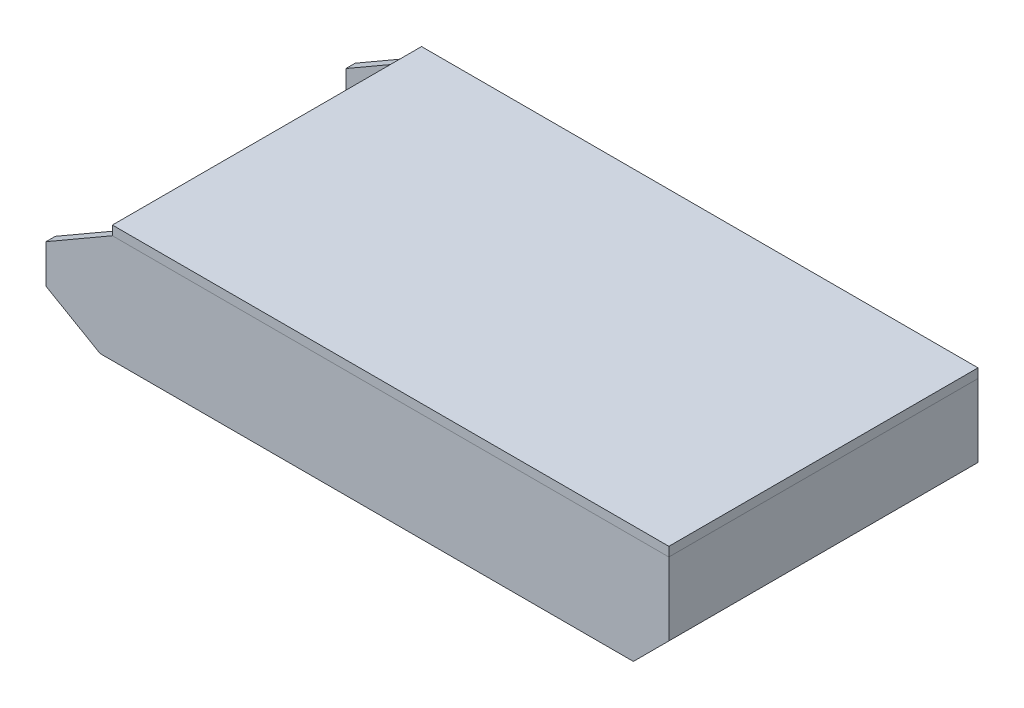
ISO-10303-21;
HEADER;
FILE_DESCRIPTION(('STEP AP214'),'2;1');
FILE_NAME('part.step','',(''),(''),'','','');
FILE_SCHEMA(('AUTOMOTIVE_DESIGN { 1 0 10303 214 1 1 1 1 }'));
ENDSEC;
DATA;
#1=APPLICATION_CONTEXT('core data for automotive mechanical design processes');
#2=APPLICATION_PROTOCOL_DEFINITION('international standard','automotive_design',2000,#1);
#3=PRODUCT_CONTEXT('',#1,'mechanical');
#4=PRODUCT('Part','Part','',(#3));
#5=PRODUCT_RELATED_PRODUCT_CATEGORY('part','',(#4));
#6=PRODUCT_DEFINITION_FORMATION('','',#4);
#7=PRODUCT_DEFINITION_CONTEXT('part definition',#1,'design');
#8=PRODUCT_DEFINITION('design','',#6,#7);
#9=PRODUCT_DEFINITION_SHAPE('','',#8);
#10=(LENGTH_UNIT() NAMED_UNIT(*) SI_UNIT(.MILLI.,.METRE.));
#11=(NAMED_UNIT(*) PLANE_ANGLE_UNIT() SI_UNIT($,.RADIAN.));
#12=(NAMED_UNIT(*) SI_UNIT($,.STERADIAN.) SOLID_ANGLE_UNIT());
#13=UNCERTAINTY_MEASURE_WITH_UNIT(LENGTH_MEASURE(1.E-05),#10,'distance_accuracy_value','');
#14=(GEOMETRIC_REPRESENTATION_CONTEXT(3) GLOBAL_UNCERTAINTY_ASSIGNED_CONTEXT((#13)) GLOBAL_UNIT_ASSIGNED_CONTEXT((#10,
#11,#12)) REPRESENTATION_CONTEXT('',''));
#15=CARTESIAN_POINT('',(0.,0.,0.));
#16=DIRECTION('',(0.,0.,1.));
#17=DIRECTION('',(1.,0.,0.));
#18=AXIS2_PLACEMENT_3D('',#15,#16,#17);
#19=CARTESIAN_POINT('',(-180.,75.9999999999932,100.));
#20=DIRECTION('',(1.,0.,0.));
#21=DIRECTION('',(0.,0.,-1.));
#22=AXIS2_PLACEMENT_3D('',#19,#20,#21);
#23=PLANE('',#22);
#24=DIRECTION('',(0.,0.,1.));
#25=VECTOR('',#24,1.);
#26=CARTESIAN_POINT('',(-180.,69.9999999999932,100.));
#27=LINE('',#26,#25);
#28=CARTESIAN_POINT('',(-180.,69.9999999999932,-100.));
#29=VERTEX_POINT('',#28);
#30=CARTESIAN_POINT('',(-180.,69.9999999999932,100.));
#31=VERTEX_POINT('',#30);
#32=EDGE_CURVE('E115',#29,#31,#27,.T.);
#33=ORIENTED_EDGE('',*,*,#32,.T.);
#34=DIRECTION('',(0.,-1.,0.));
#35=VECTOR('',#34,1.);
#36=CARTESIAN_POINT('',(-180.,75.9999999999932,100.));
#37=LINE('',#36,#35);
#38=CARTESIAN_POINT('',(-180.,75.9999999999932,100.));
#39=VERTEX_POINT('',#38);
#40=EDGE_CURVE('E12',#39,#31,#37,.T.);
#41=ORIENTED_EDGE('',*,*,#40,.F.);
#42=DIRECTION('',(0.,0.,1.));
#43=VECTOR('',#42,1.);
#44=CARTESIAN_POINT('',(-180.,75.9999999999932,100.));
#45=LINE('',#44,#43);
#46=CARTESIAN_POINT('',(-180.,75.9999999999932,-100.));
#47=VERTEX_POINT('',#46);
#48=EDGE_CURVE('E103',#47,#39,#45,.T.);
#49=ORIENTED_EDGE('',*,*,#48,.F.);
#50=DIRECTION('',(0.,-1.,0.));
#51=VECTOR('',#50,1.);
#52=CARTESIAN_POINT('',(-180.,75.9999999999932,-100.));
#53=LINE('',#52,#51);
#54=EDGE_CURVE('E111',#47,#29,#53,.T.);
#55=ORIENTED_EDGE('',*,*,#54,.T.);
#56=EDGE_LOOP('',(#33,#41,#49,#55));
#57=FACE_BOUND('',#56,.T.);
#58=ADVANCED_FACE('F52',(#57),#23,.F.);
#59=CARTESIAN_POINT('',(180.,75.9999999999932,100.));
#60=DIRECTION('',(0.,0.,-1.));
#61=DIRECTION('',(-1.,0.,0.));
#62=AXIS2_PLACEMENT_3D('',#59,#60,#61);
#63=PLANE('',#62);
#64=DIRECTION('',(1.,0.,0.));
#65=VECTOR('',#64,1.);
#66=CARTESIAN_POINT('',(180.,69.9999999999932,100.));
#67=LINE('',#66,#65);
#68=CARTESIAN_POINT('',(180.,69.9999999999932,100.));
#69=VERTEX_POINT('',#68);
#70=EDGE_CURVE('E107',#31,#69,#67,.T.);
#71=ORIENTED_EDGE('',*,*,#70,.T.);
#72=DIRECTION('',(0.,-1.,0.));
#73=VECTOR('',#72,1.);
#74=CARTESIAN_POINT('',(180.,75.9999999999932,100.));
#75=LINE('',#74,#73);
#76=CARTESIAN_POINT('',(180.,75.9999999999932,100.));
#77=VERTEX_POINT('',#76);
#78=EDGE_CURVE('E60',#77,#69,#75,.T.);
#79=ORIENTED_EDGE('',*,*,#78,.F.);
#80=DIRECTION('',(1.,0.,0.));
#81=VECTOR('',#80,1.);
#82=CARTESIAN_POINT('',(180.,75.9999999999932,100.));
#83=LINE('',#82,#81);
#84=EDGE_CURVE('E98',#39,#77,#83,.T.);
#85=ORIENTED_EDGE('',*,*,#84,.F.);
#86=ORIENTED_EDGE('',*,*,#40,.T.);
#87=EDGE_LOOP('',(#71,#79,#85,#86));
#88=FACE_BOUND('',#87,.T.);
#89=ADVANCED_FACE('F106',(#88),#63,.F.);
#90=CARTESIAN_POINT('',(180.,75.9999999999932,-100.));
#91=DIRECTION('',(-1.,0.,0.));
#92=DIRECTION('',(0.,0.,1.));
#93=AXIS2_PLACEMENT_3D('',#90,#91,#92);
#94=PLANE('',#93);
#95=DIRECTION('',(0.,0.,-1.));
#96=VECTOR('',#95,1.);
#97=CARTESIAN_POINT('',(180.,69.9999999999932,-100.));
#98=LINE('',#97,#96);
#99=CARTESIAN_POINT('',(180.,69.9999999999932,-100.));
#100=VERTEX_POINT('',#99);
#101=EDGE_CURVE('E85',#69,#100,#98,.T.);
#102=ORIENTED_EDGE('',*,*,#101,.T.);
#103=DIRECTION('',(0.,-1.,0.));
#104=VECTOR('',#103,1.);
#105=CARTESIAN_POINT('',(180.,75.9999999999932,-100.));
#106=LINE('',#105,#104);
#107=CARTESIAN_POINT('',(180.,75.9999999999932,-100.));
#108=VERTEX_POINT('',#107);
#109=EDGE_CURVE('E108',#108,#100,#106,.T.);
#110=ORIENTED_EDGE('',*,*,#109,.F.);
#111=DIRECTION('',(0.,0.,-1.));
#112=VECTOR('',#111,1.);
#113=CARTESIAN_POINT('',(180.,75.9999999999932,-100.));
#114=LINE('',#113,#112);
#115=EDGE_CURVE('E101',#77,#108,#114,.T.);
#116=ORIENTED_EDGE('',*,*,#115,.F.);
#117=ORIENTED_EDGE('',*,*,#78,.T.);
#118=EDGE_LOOP('',(#102,#110,#116,#117));
#119=FACE_BOUND('',#118,.T.);
#120=ADVANCED_FACE('F109',(#119),#94,.F.);
#121=CARTESIAN_POINT('',(-180.,75.9999999999932,-100.));
#122=DIRECTION('',(0.,0.,1.));
#123=DIRECTION('',(1.,0.,0.));
#124=AXIS2_PLACEMENT_3D('',#121,#122,#123);
#125=PLANE('',#124);
#126=DIRECTION('',(-1.,0.,0.));
#127=VECTOR('',#126,1.);
#128=CARTESIAN_POINT('',(-180.,69.9999999999932,-100.));
#129=LINE('',#128,#127);
#130=EDGE_CURVE('E91',#100,#29,#129,.T.);
#131=ORIENTED_EDGE('',*,*,#130,.T.);
#132=ORIENTED_EDGE('',*,*,#54,.F.);
#133=DIRECTION('',(-1.,0.,0.));
#134=VECTOR('',#133,1.);
#135=CARTESIAN_POINT('',(-180.,75.9999999999932,-100.));
#136=LINE('',#135,#134);
#137=EDGE_CURVE('E68',#108,#47,#136,.T.);
#138=ORIENTED_EDGE('',*,*,#137,.F.);
#139=ORIENTED_EDGE('',*,*,#109,.T.);
#140=EDGE_LOOP('',(#131,#132,#138,#139));
#141=FACE_BOUND('',#140,.T.);
#142=ADVANCED_FACE('F122',(#141),#125,.F.);
#143=CARTESIAN_POINT('',(0.,75.9999999999932,0.));
#144=DIRECTION('',(0.,-1.,0.));
#145=DIRECTION('',(0.,0.,-1.));
#146=AXIS2_PLACEMENT_3D('',#143,#144,#145);
#147=PLANE('',#146);
#148=ORIENTED_EDGE('',*,*,#48,.T.);
#149=ORIENTED_EDGE('',*,*,#84,.T.);
#150=ORIENTED_EDGE('',*,*,#115,.T.);
#151=ORIENTED_EDGE('',*,*,#137,.T.);
#152=EDGE_LOOP('',(#148,#149,#150,#151));
#153=FACE_BOUND('',#152,.T.);
#154=ADVANCED_FACE('F99',(#153),#147,.F.);
#155=CARTESIAN_POINT('',(0.,69.9999999999932,0.));
#156=DIRECTION('',(0.,-1.,0.));
#157=DIRECTION('',(0.,0.,-1.));
#158=AXIS2_PLACEMENT_3D('',#155,#156,#157);
#159=PLANE('',#158);
#160=ORIENTED_EDGE('',*,*,#32,.F.);
#161=ORIENTED_EDGE('',*,*,#130,.F.);
#162=ORIENTED_EDGE('',*,*,#101,.F.);
#163=ORIENTED_EDGE('',*,*,#70,.F.);
#164=EDGE_LOOP('',(#160,#161,#162,#163));
#165=FACE_BOUND('',#164,.T.);
#166=ADVANCED_FACE('F125',(#165),#159,.T.);
#167=CLOSED_SHELL('',(#58,#89,#120,#142,#154,#166));
#168=MANIFOLD_SOLID_BREP('B2_NOT_SHOWN',#167);
#169=CARTESIAN_POINT('',(180.,69.9999999999932,141.423476786197));
#170=DIRECTION('',(-1.,0.,0.));
#171=DIRECTION('',(0.,0.,1.));
#172=AXIS2_PLACEMENT_3D('',#169,#170,#171);
#173=PLANE('',#172);
#174=DIRECTION('',(0.,0.,-1.));
#175=VECTOR('',#174,1.);
#176=CARTESIAN_POINT('',(180.,69.9999999999932,141.423476786197));
#177=LINE('',#176,#175);
#178=CARTESIAN_POINT('',(180.,69.9999999999932,100.));
#179=VERTEX_POINT('',#178);
#180=CARTESIAN_POINT('',(180.,69.9999999999932,-100.));
#181=VERTEX_POINT('',#180);
#182=EDGE_CURVE('E449',#179,#181,#177,.T.);
#183=ORIENTED_EDGE('',*,*,#182,.F.);
#184=DIRECTION('',(0.,1.,0.));
#185=VECTOR('',#184,1.);
#186=CARTESIAN_POINT('',(180.,69.9999999999932,100.));
#187=LINE('',#186,#185);
#188=CARTESIAN_POINT('',(180.,22.9576132568553,100.));
#189=VERTEX_POINT('',#188);
#190=EDGE_CURVE('E358',#189,#179,#187,.T.);
#191=ORIENTED_EDGE('',*,*,#190,.F.);
#192=DIRECTION('',(0.,0.,-1.));
#193=VECTOR('',#192,1.);
#194=CARTESIAN_POINT('',(180.,22.9576132568553,141.423476786197));
#195=LINE('',#194,#193);
#196=CARTESIAN_POINT('',(180.,22.9576132568553,-100.));
#197=VERTEX_POINT('',#196);
#198=EDGE_CURVE('E178',#189,#197,#195,.T.);
#199=ORIENTED_EDGE('',*,*,#198,.T.);
#200=DIRECTION('',(0.,-1.,0.));
#201=VECTOR('',#200,1.);
#202=CARTESIAN_POINT('',(180.,22.9576132568553,-100.));
#203=LINE('',#202,#201);
#204=EDGE_CURVE('E387',#181,#197,#203,.T.);
#205=ORIENTED_EDGE('',*,*,#204,.F.);
#206=EDGE_LOOP('',(#183,#191,#199,#205));
#207=FACE_BOUND('',#206,.T.);
#208=ADVANCED_FACE('F175',(#207),#173,.F.);
#209=CARTESIAN_POINT('',(180.,69.9999999999932,141.423476786197));
#210=DIRECTION('',(0.,-1.,0.));
#211=DIRECTION('',(0.,0.,-1.));
#212=AXIS2_PLACEMENT_3D('',#209,#210,#211);
#213=PLANE('',#212);
#214=DIRECTION('',(1.,0.,0.));
#215=VECTOR('',#214,1.);
#216=CARTESIAN_POINT('',(180.,69.9999999999932,-94.));
#217=LINE('',#216,#215);
#218=CARTESIAN_POINT('',(-171.514718625755,69.9999999999932,-94.));
#219=VERTEX_POINT('',#218);
#220=CARTESIAN_POINT('',(174.,69.9999999999932,-94.));
#221=VERTEX_POINT('',#220);
#222=EDGE_CURVE('E403',#219,#221,#217,.T.);
#223=ORIENTED_EDGE('',*,*,#222,.T.);
#224=DIRECTION('',(0.,0.,-1.));
#225=VECTOR('',#224,1.);
#226=CARTESIAN_POINT('',(174.,69.9999999999932,141.423476786197));
#227=LINE('',#226,#225);
#228=CARTESIAN_POINT('',(174.,69.9999999999932,94.));
#229=VERTEX_POINT('',#228);
#230=EDGE_CURVE('E447',#229,#221,#227,.T.);
#231=ORIENTED_EDGE('',*,*,#230,.F.);
#232=DIRECTION('',(-1.,0.,0.));
#233=VECTOR('',#232,1.);
#234=CARTESIAN_POINT('',(-180.,69.9999999999932,94.));
#235=LINE('',#234,#233);
#236=CARTESIAN_POINT('',(-171.514718625755,69.9999999999932,94.));
#237=VERTEX_POINT('',#236);
#238=EDGE_CURVE('E340',#229,#237,#235,.T.);
#239=ORIENTED_EDGE('',*,*,#238,.T.);
#240=DIRECTION('',(0.,0.,-1.));
#241=VECTOR('',#240,1.);
#242=CARTESIAN_POINT('',(-171.514718625755,69.9999999999932,192.994949366112));
#243=LINE('',#242,#241);
#244=EDGE_CURVE('E312',#237,#219,#243,.T.);
#245=ORIENTED_EDGE('',*,*,#244,.T.);
#246=EDGE_LOOP('',(#223,#231,#239,#245));
#247=FACE_BOUND('',#246,.T.);
#248=ORIENTED_EDGE('',*,*,#182,.T.);
#249=DIRECTION('',(1.,0.,0.));
#250=VECTOR('',#249,1.);
#251=CARTESIAN_POINT('',(180.,69.9999999999932,-100.));
#252=LINE('',#251,#250);
#253=CARTESIAN_POINT('',(-180.,69.9999999999932,-100.));
#254=VERTEX_POINT('',#253);
#255=EDGE_CURVE('E394',#254,#181,#252,.T.);
#256=ORIENTED_EDGE('',*,*,#255,.F.);
#257=DIRECTION('',(0.,0.,-1.));
#258=VECTOR('',#257,1.);
#259=CARTESIAN_POINT('',(-180.,69.9999999999932,-94.));
#260=LINE('',#259,#258);
#261=CARTESIAN_POINT('',(-180.,69.9999999999932,-94.));
#262=VERTEX_POINT('',#261);
#263=EDGE_CURVE('E426',#262,#254,#260,.T.);
#264=ORIENTED_EDGE('',*,*,#263,.F.);
#265=DIRECTION('',(0.,0.,-1.));
#266=VECTOR('',#265,1.);
#267=CARTESIAN_POINT('',(-180.,69.9999999999932,192.994949366112));
#268=LINE('',#267,#266);
#269=CARTESIAN_POINT('',(-180.,69.9999999999932,94.));
#270=VERTEX_POINT('',#269);
#271=EDGE_CURVE('E338',#270,#262,#268,.T.);
#272=ORIENTED_EDGE('',*,*,#271,.F.);
#273=DIRECTION('',(0.,0.,1.));
#274=VECTOR('',#273,1.);
#275=CARTESIAN_POINT('',(-180.,69.9999999999932,94.));
#276=LINE('',#275,#274);
#277=CARTESIAN_POINT('',(-180.,69.9999999999932,100.));
#278=VERTEX_POINT('',#277);
#279=EDGE_CURVE('E355',#270,#278,#276,.T.);
#280=ORIENTED_EDGE('',*,*,#279,.T.);
#281=DIRECTION('',(-1.,0.,0.));
#282=VECTOR('',#281,1.);
#283=CARTESIAN_POINT('',(-180.,69.9999999999932,100.));
#284=LINE('',#283,#282);
#285=EDGE_CURVE('E361',#179,#278,#284,.T.);
#286=ORIENTED_EDGE('',*,*,#285,.F.);
#287=EDGE_LOOP('',(#248,#256,#264,#272,#280,#286));
#288=FACE_BOUND('',#287,.T.);
#289=ADVANCED_FACE('F465',(#247,#288),#213,.F.);
#290=CARTESIAN_POINT('',(174.,22.9576132568553,141.423476786197));
#291=DIRECTION('',(1.,0.,0.));
#292=DIRECTION('',(0.,0.,-1.));
#293=AXIS2_PLACEMENT_3D('',#290,#291,#292);
#294=PLANE('',#293);
#295=DIRECTION('',(0.,-1.,0.));
#296=VECTOR('',#295,1.);
#297=CARTESIAN_POINT('',(174.,22.9576132568553,94.));
#298=LINE('',#297,#296);
#299=CARTESIAN_POINT('',(174.,22.9576132568553,94.));
#300=VERTEX_POINT('',#299);
#301=EDGE_CURVE('E50',#229,#300,#298,.T.);
#302=ORIENTED_EDGE('',*,*,#301,.F.);
#303=ORIENTED_EDGE('',*,*,#230,.T.);
#304=DIRECTION('',(0.,-1.,0.));
#305=VECTOR('',#304,1.);
#306=CARTESIAN_POINT('',(174.,22.9576132568553,-94.));
#307=LINE('',#306,#305);
#308=CARTESIAN_POINT('',(174.,22.9576132568553,-94.));
#309=VERTEX_POINT('',#308);
#310=EDGE_CURVE('E446',#221,#309,#307,.T.);
#311=ORIENTED_EDGE('',*,*,#310,.T.);
#312=DIRECTION('',(0.,0.,-1.));
#313=VECTOR('',#312,1.);
#314=CARTESIAN_POINT('',(174.,22.9576132568553,141.423476786197));
#315=LINE('',#314,#313);
#316=EDGE_CURVE('E183',#300,#309,#315,.T.);
#317=ORIENTED_EDGE('',*,*,#316,.F.);
#318=EDGE_LOOP('',(#302,#303,#311,#317));
#319=FACE_BOUND('',#318,.T.);
#320=ADVANCED_FACE('F460',(#319),#294,.F.);
#321=CARTESIAN_POINT('',(171.514718625762,22.9576132568553,124.576159578633));
#322=DIRECTION('',(0.,-1.,0.));
#323=DIRECTION('',(0.,0.,-1.));
#324=AXIS2_PLACEMENT_3D('',#321,#322,#323);
#325=PLANE('',#324);
#326=DIRECTION('',(-1.,0.,0.));
#327=VECTOR('',#326,1.);
#328=CARTESIAN_POINT('',(171.514718625762,22.9576132568553,94.));
#329=LINE('',#328,#327);
#330=CARTESIAN_POINT('',(171.514718625762,22.9576132568553,94.));
#331=VERTEX_POINT('',#330);
#332=EDGE_CURVE('E441',#300,#331,#329,.T.);
#333=ORIENTED_EDGE('',*,*,#332,.F.);
#334=ORIENTED_EDGE('',*,*,#316,.T.);
#335=DIRECTION('',(-1.,0.,0.));
#336=VECTOR('',#335,1.);
#337=CARTESIAN_POINT('',(171.514718625762,22.9576132568553,-94.));
#338=LINE('',#337,#336);
#339=CARTESIAN_POINT('',(171.514718625762,22.9576132568553,-94.));
#340=VERTEX_POINT('',#339);
#341=EDGE_CURVE('E191',#309,#340,#338,.T.);
#342=ORIENTED_EDGE('',*,*,#341,.T.);
#343=DIRECTION('',(0.,0.,-1.));
#344=VECTOR('',#343,1.);
#345=CARTESIAN_POINT('',(171.514718625762,22.9576132568553,124.576159578633));
#346=LINE('',#345,#344);
#347=EDGE_CURVE('E437',#331,#340,#346,.T.);
#348=ORIENTED_EDGE('',*,*,#347,.F.);
#349=EDGE_LOOP('',(#333,#334,#342,#348));
#350=FACE_BOUND('',#349,.T.);
#351=ADVANCED_FACE('F456',(#350),#325,.F.);
#352=CARTESIAN_POINT('',(154.557105368906,6.,124.576159578633));
#353=DIRECTION('',(0.707106781186547,-0.707106781186548,0.));
#354=DIRECTION('',(0.707106781186548,0.707106781186547,0.));
#355=AXIS2_PLACEMENT_3D('',#352,#353,#354);
#356=PLANE('',#355);
#357=DIRECTION('',(-0.707106781186548,-0.707106781186547,0.));
#358=VECTOR('',#357,1.);
#359=CARTESIAN_POINT('',(154.557105368906,6.,94.));
#360=LINE('',#359,#358);
#361=CARTESIAN_POINT('',(154.557105368906,6.,94.));
#362=VERTEX_POINT('',#361);
#363=EDGE_CURVE('E439',#331,#362,#360,.T.);
#364=ORIENTED_EDGE('',*,*,#363,.F.);
#365=ORIENTED_EDGE('',*,*,#347,.T.);
#366=DIRECTION('',(-0.707106781186548,-0.707106781186547,0.));
#367=VECTOR('',#366,1.);
#368=CARTESIAN_POINT('',(154.557105368906,6.,-94.));
#369=LINE('',#368,#367);
#370=CARTESIAN_POINT('',(154.557105368906,6.,-94.));
#371=VERTEX_POINT('',#370);
#372=EDGE_CURVE('E196',#340,#371,#369,.T.);
#373=ORIENTED_EDGE('',*,*,#372,.T.);
#374=DIRECTION('',(0.,0.,-1.));
#375=VECTOR('',#374,1.);
#376=CARTESIAN_POINT('',(154.557105368906,6.,124.576159578633));
#377=LINE('',#376,#375);
#378=EDGE_CURVE('E436',#362,#371,#377,.T.);
#379=ORIENTED_EDGE('',*,*,#378,.F.);
#380=EDGE_LOOP('',(#364,#365,#373,#379));
#381=FACE_BOUND('',#380,.T.);
#382=ADVANCED_FACE('F542',(#381),#356,.F.);
#383=CARTESIAN_POINT('',(180.,22.9576132568553,124.576159578633));
#384=DIRECTION('',(-0.707106781186549,0.707106781186546,0.));
#385=DIRECTION('',(-0.707106781186546,-0.707106781186549,0.));
#386=AXIS2_PLACEMENT_3D('',#383,#384,#385);
#387=PLANE('',#386);
#388=DIRECTION('',(-0.707106781186546,-0.707106781186549,0.));
#389=VECTOR('',#388,1.);
#390=CARTESIAN_POINT('',(157.042386743145,0.,-100.));
#391=LINE('',#390,#389);
#392=CARTESIAN_POINT('',(157.042386743145,0.,-100.));
#393=VERTEX_POINT('',#392);
#394=EDGE_CURVE('E409',#197,#393,#391,.T.);
#395=ORIENTED_EDGE('',*,*,#394,.F.);
#396=ORIENTED_EDGE('',*,*,#198,.F.);
#397=DIRECTION('',(0.707106781186546,0.707106781186549,0.));
#398=VECTOR('',#397,1.);
#399=CARTESIAN_POINT('',(180.,22.9576132568553,100.));
#400=LINE('',#399,#398);
#401=CARTESIAN_POINT('',(157.042386743145,0.,100.));
#402=VERTEX_POINT('',#401);
#403=EDGE_CURVE('E315',#402,#189,#400,.T.);
#404=ORIENTED_EDGE('',*,*,#403,.F.);
#405=DIRECTION('',(0.,0.,-1.));
#406=VECTOR('',#405,1.);
#407=CARTESIAN_POINT('',(157.042386743145,0.,-94.));
#408=LINE('',#407,#406);
#409=EDGE_CURVE('E406',#402,#393,#408,.T.);
#410=ORIENTED_EDGE('',*,*,#409,.T.);
#411=EDGE_LOOP('',(#395,#396,#404,#410));
#412=FACE_BOUND('',#411,.T.);
#413=ADVANCED_FACE('F517',(#412),#387,.F.);
#414=CARTESIAN_POINT('',(0.,0.,-94.));
#415=DIRECTION('',(0.,0.,1.));
#416=DIRECTION('',(1.,0.,0.));
#417=AXIS2_PLACEMENT_3D('',#414,#415,#416);
#418=PLANE('',#417);
#419=ORIENTED_EDGE('',*,*,#310,.F.);
#420=ORIENTED_EDGE('',*,*,#222,.F.);
#421=DIRECTION('',(-0.707106781186548,0.707106781186547,0.));
#422=VECTOR('',#421,1.);
#423=CARTESIAN_POINT('',(-110.000000000003,8.4852813742416,-94.));
#424=LINE('',#423,#422);
#425=CARTESIAN_POINT('',(-110.000000000003,8.4852813742416,-94.));
#426=VERTEX_POINT('',#425);
#427=EDGE_CURVE('E325',#426,#219,#424,.T.);
#428=ORIENTED_EDGE('',*,*,#427,.F.);
#429=DIRECTION('',(0.,1.,0.));
#430=VECTOR('',#429,1.);
#431=CARTESIAN_POINT('',(-110.000000000003,-3.41004455870382E-12,-94.));
#432=LINE('',#431,#430);
#433=CARTESIAN_POINT('',(-110.000000000003,6.,-94.));
#434=VERTEX_POINT('',#433);
#435=EDGE_CURVE('E324',#434,#426,#432,.T.);
#436=ORIENTED_EDGE('',*,*,#435,.F.);
#437=DIRECTION('',(-1.,0.,0.));
#438=VECTOR('',#437,1.);
#439=CARTESIAN_POINT('',(-110.000000000003,6.,-94.));
#440=LINE('',#439,#438);
#441=EDGE_CURVE('E383',#371,#434,#440,.T.);
#442=ORIENTED_EDGE('',*,*,#441,.F.);
#443=ORIENTED_EDGE('',*,*,#372,.F.);
#444=ORIENTED_EDGE('',*,*,#341,.F.);
#445=EDGE_LOOP('',(#419,#420,#428,#436,#442,#443,#444));
#446=FACE_BOUND('',#445,.T.);
#447=ADVANCED_FACE('F463',(#446),#418,.T.);
#448=CARTESIAN_POINT('',(0.,0.,94.));
#449=DIRECTION('',(0.,0.,1.));
#450=DIRECTION('',(1.,0.,0.));
#451=AXIS2_PLACEMENT_3D('',#448,#449,#450);
#452=PLANE('',#451);
#453=ORIENTED_EDGE('',*,*,#238,.F.);
#454=ORIENTED_EDGE('',*,*,#301,.T.);
#455=ORIENTED_EDGE('',*,*,#332,.T.);
#456=ORIENTED_EDGE('',*,*,#363,.T.);
#457=DIRECTION('',(-1.,0.,0.));
#458=VECTOR('',#457,1.);
#459=CARTESIAN_POINT('',(-110.000000000003,6.,94.));
#460=LINE('',#459,#458);
#461=CARTESIAN_POINT('',(-110.000000000003,6.,94.));
#462=VERTEX_POINT('',#461);
#463=EDGE_CURVE('E329',#362,#462,#460,.T.);
#464=ORIENTED_EDGE('',*,*,#463,.T.);
#465=DIRECTION('',(0.,1.,0.));
#466=VECTOR('',#465,1.);
#467=CARTESIAN_POINT('',(-110.000000000003,-3.41004455870382E-12,94.));
#468=LINE('',#467,#466);
#469=CARTESIAN_POINT('',(-110.000000000003,8.4852813742416,94.));
#470=VERTEX_POINT('',#469);
#471=EDGE_CURVE('E316',#462,#470,#468,.T.);
#472=ORIENTED_EDGE('',*,*,#471,.T.);
#473=DIRECTION('',(-0.707106781186548,0.707106781186547,0.));
#474=VECTOR('',#473,1.);
#475=CARTESIAN_POINT('',(-110.000000000003,8.4852813742416,94.));
#476=LINE('',#475,#474);
#477=EDGE_CURVE('E306',#470,#237,#476,.T.);
#478=ORIENTED_EDGE('',*,*,#477,.T.);
#479=EDGE_LOOP('',(#453,#454,#455,#456,#464,#472,#478));
#480=FACE_BOUND('',#479,.T.);
#481=ADVANCED_FACE('F327',(#480),#452,.F.);
#482=CARTESIAN_POINT('',(-110.000000000003,6.,367.108302617103));
#483=DIRECTION('',(0.,-1.,0.));
#484=DIRECTION('',(1.,0.,0.));
#485=AXIS2_PLACEMENT_3D('',#482,#483,#484);
#486=PLANE('',#485);
#487=ORIENTED_EDGE('',*,*,#463,.F.);
#488=ORIENTED_EDGE('',*,*,#378,.T.);
#489=ORIENTED_EDGE('',*,*,#441,.T.);
#490=DIRECTION('',(0.,0.,-1.));
#491=VECTOR('',#490,1.);
#492=CARTESIAN_POINT('',(-110.000000000003,6.,367.108302617103));
#493=LINE('',#492,#491);
#494=EDGE_CURVE('E377',#462,#434,#493,.T.);
#495=ORIENTED_EDGE('',*,*,#494,.F.);
#496=EDGE_LOOP('',(#487,#488,#489,#495));
#497=FACE_BOUND('',#496,.T.);
#498=ADVANCED_FACE('F560',(#497),#486,.F.);
#499=DIRECTION('',(-1.,0.,0.));
#500=VECTOR('',#499,1.);
#501=CARTESIAN_POINT('',(-187.957613256855,0.,-94.));
#502=LINE('',#501,#500);
#503=CARTESIAN_POINT('',(-110.000000000003,-3.41004455870382E-12,-94.));
#504=VERTEX_POINT('',#503);
#505=CARTESIAN_POINT('',(-187.957613256855,0.,-94.));
#506=VERTEX_POINT('',#505);
#507=EDGE_CURVE('E391',#504,#506,#502,.T.);
#508=ORIENTED_EDGE('',*,*,#507,.F.);
#509=DIRECTION('',(0.707106781186547,-0.707106781186547,0.));
#510=VECTOR('',#509,1.);
#511=CARTESIAN_POINT('',(-180.,69.9999999999932,-94.));
#512=LINE('',#511,#510);
#513=EDGE_CURVE('E333',#262,#504,#512,.T.);
#514=ORIENTED_EDGE('',*,*,#513,.F.);
#515=DIRECTION('',(0.866025403784441,0.499999999999995,0.));
#516=VECTOR('',#515,1.);
#517=CARTESIAN_POINT('',(-180.,69.9999999999932,-94.));
#518=LINE('',#517,#516);
#519=CARTESIAN_POINT('',(-222.957613256855,45.1984104224043,-94.));
#520=VERTEX_POINT('',#519);
#521=EDGE_CURVE('E400',#520,#262,#518,.T.);
#522=ORIENTED_EDGE('',*,*,#521,.F.);
#523=DIRECTION('',(0.,1.,0.));
#524=VECTOR('',#523,1.);
#525=CARTESIAN_POINT('',(-222.957613256855,45.1984104224043,-94.));
#526=LINE('',#525,#524);
#527=CARTESIAN_POINT('',(-222.957613256855,20.2072594216366,-94.));
#528=VERTEX_POINT('',#527);
#529=EDGE_CURVE('E397',#528,#520,#526,.T.);
#530=ORIENTED_EDGE('',*,*,#529,.F.);
#531=DIRECTION('',(-0.866025403784442,0.499999999999995,0.));
#532=VECTOR('',#531,1.);
#533=CARTESIAN_POINT('',(-222.957613256855,20.2072594216366,-94.));
#534=LINE('',#533,#532);
#535=EDGE_CURVE('E393',#506,#528,#534,.T.);
#536=ORIENTED_EDGE('',*,*,#535,.F.);
#537=EDGE_LOOP('',(#508,#514,#522,#530,#536));
#538=FACE_BOUND('',#537,.T.);
#539=ADVANCED_FACE('F478',(#538),#418,.T.);
#540=DIRECTION('',(0.707106781186548,-0.707106781186548,0.));
#541=VECTOR('',#540,1.);
#542=CARTESIAN_POINT('',(-180.,69.9999999999932,94.));
#543=LINE('',#542,#541);
#544=CARTESIAN_POINT('',(-110.000000000003,-3.41393580072236E-12,94.));
#545=VERTEX_POINT('',#544);
#546=EDGE_CURVE('E330',#270,#545,#543,.T.);
#547=ORIENTED_EDGE('',*,*,#546,.T.);
#548=DIRECTION('',(1.,0.,0.));
#549=VECTOR('',#548,1.);
#550=CARTESIAN_POINT('',(157.042386743145,0.,94.));
#551=LINE('',#550,#549);
#552=CARTESIAN_POINT('',(-187.957613256855,0.,94.));
#553=VERTEX_POINT('',#552);
#554=EDGE_CURVE('E352',#553,#545,#551,.T.);
#555=ORIENTED_EDGE('',*,*,#554,.F.);
#556=DIRECTION('',(0.866025403784442,-0.499999999999995,0.));
#557=VECTOR('',#556,1.);
#558=CARTESIAN_POINT('',(-222.957613256855,20.2072594216366,94.));
#559=LINE('',#558,#557);
#560=CARTESIAN_POINT('',(-222.957613256855,20.2072594216366,94.));
#561=VERTEX_POINT('',#560);
#562=EDGE_CURVE('E349',#561,#553,#559,.T.);
#563=ORIENTED_EDGE('',*,*,#562,.F.);
#564=DIRECTION('',(0.,-1.,0.));
#565=VECTOR('',#564,1.);
#566=CARTESIAN_POINT('',(-222.957613256855,45.1984104224043,94.));
#567=LINE('',#566,#565);
#568=CARTESIAN_POINT('',(-222.957613256855,45.1984104224043,94.));
#569=VERTEX_POINT('',#568);
#570=EDGE_CURVE('E346',#569,#561,#567,.T.);
#571=ORIENTED_EDGE('',*,*,#570,.F.);
#572=DIRECTION('',(-0.866025403784441,-0.499999999999995,0.));
#573=VECTOR('',#572,1.);
#574=CARTESIAN_POINT('',(-180.,69.9999999999932,94.));
#575=LINE('',#574,#573);
#576=EDGE_CURVE('E342',#270,#569,#575,.T.);
#577=ORIENTED_EDGE('',*,*,#576,.F.);
#578=EDGE_LOOP('',(#547,#555,#563,#571,#577));
#579=FACE_BOUND('',#578,.T.);
#580=ADVANCED_FACE('F488',(#579),#452,.F.);
#581=CARTESIAN_POINT('',(-180.,69.9999999999932,-94.));
#582=DIRECTION('',(-0.499999999999995,0.866025403784441,0.));
#583=DIRECTION('',(-0.866025403784442,-0.499999999999995,0.));
#584=AXIS2_PLACEMENT_3D('',#581,#582,#583);
#585=PLANE('',#584);
#586=DIRECTION('',(0.866025403784441,0.499999999999995,0.));
#587=VECTOR('',#586,1.);
#588=CARTESIAN_POINT('',(-180.,69.9999999999932,-100.));
#589=LINE('',#588,#587);
#590=CARTESIAN_POINT('',(-222.957613256855,45.1984104224043,-100.));
#591=VERTEX_POINT('',#590);
#592=EDGE_CURVE('E421',#591,#254,#589,.T.);
#593=ORIENTED_EDGE('',*,*,#592,.F.);
#594=DIRECTION('',(0.,0.,-1.));
#595=VECTOR('',#594,1.);
#596=CARTESIAN_POINT('',(-222.957613256855,45.1984104224043,-94.));
#597=LINE('',#596,#595);
#598=EDGE_CURVE('E428',#520,#591,#597,.T.);
#599=ORIENTED_EDGE('',*,*,#598,.F.);
#600=ORIENTED_EDGE('',*,*,#521,.T.);
#601=ORIENTED_EDGE('',*,*,#263,.T.);
#602=EDGE_LOOP('',(#593,#599,#600,#601));
#603=FACE_BOUND('',#602,.T.);
#604=ADVANCED_FACE('F509',(#603),#585,.T.);
#605=CARTESIAN_POINT('',(-222.957613256855,45.1984104224043,-94.));
#606=DIRECTION('',(-1.,0.,0.));
#607=DIRECTION('',(0.,0.,1.));
#608=AXIS2_PLACEMENT_3D('',#605,#606,#607);
#609=PLANE('',#608);
#610=DIRECTION('',(0.,1.,0.));
#611=VECTOR('',#610,1.);
#612=CARTESIAN_POINT('',(-222.957613256855,45.1984104224043,-100.));
#613=LINE('',#612,#611);
#614=CARTESIAN_POINT('',(-222.957613256855,20.2072594216366,-100.));
#615=VERTEX_POINT('',#614);
#616=EDGE_CURVE('E418',#615,#591,#613,.T.);
#617=ORIENTED_EDGE('',*,*,#616,.F.);
#618=DIRECTION('',(0.,0.,-1.));
#619=VECTOR('',#618,1.);
#620=CARTESIAN_POINT('',(-222.957613256855,20.2072594216366,-94.));
#621=LINE('',#620,#619);
#622=EDGE_CURVE('E430',#528,#615,#621,.T.);
#623=ORIENTED_EDGE('',*,*,#622,.F.);
#624=ORIENTED_EDGE('',*,*,#529,.T.);
#625=ORIENTED_EDGE('',*,*,#598,.T.);
#626=EDGE_LOOP('',(#617,#623,#624,#625));
#627=FACE_BOUND('',#626,.T.);
#628=ADVANCED_FACE('F511',(#627),#609,.T.);
#629=CARTESIAN_POINT('',(-222.957613256855,20.2072594216366,-94.));
#630=DIRECTION('',(-0.499999999999995,-0.866025403784442,0.));
#631=DIRECTION('',(0.866025403784442,-0.499999999999995,0.));
#632=AXIS2_PLACEMENT_3D('',#629,#630,#631);
#633=PLANE('',#632);
#634=DIRECTION('',(-0.866025403784442,0.499999999999995,0.));
#635=VECTOR('',#634,1.);
#636=CARTESIAN_POINT('',(-222.957613256855,20.2072594216366,-100.));
#637=LINE('',#636,#635);
#638=CARTESIAN_POINT('',(-187.957613256855,0.,-100.));
#639=VERTEX_POINT('',#638);
#640=EDGE_CURVE('E415',#639,#615,#637,.T.);
#641=ORIENTED_EDGE('',*,*,#640,.F.);
#642=DIRECTION('',(0.,0.,-1.));
#643=VECTOR('',#642,1.);
#644=CARTESIAN_POINT('',(-187.957613256855,0.,-94.));
#645=LINE('',#644,#643);
#646=EDGE_CURVE('E432',#506,#639,#645,.T.);
#647=ORIENTED_EDGE('',*,*,#646,.F.);
#648=ORIENTED_EDGE('',*,*,#535,.T.);
#649=ORIENTED_EDGE('',*,*,#622,.T.);
#650=EDGE_LOOP('',(#641,#647,#648,#649));
#651=FACE_BOUND('',#650,.T.);
#652=ADVANCED_FACE('F514',(#651),#633,.T.);
#653=CARTESIAN_POINT('',(-187.957613256855,0.,-94.));
#654=DIRECTION('',(0.,-1.,0.));
#655=DIRECTION('',(1.,0.,0.));
#656=AXIS2_PLACEMENT_3D('',#653,#654,#655);
#657=PLANE('',#656);
#658=DIRECTION('',(-1.,0.,0.));
#659=VECTOR('',#658,1.);
#660=CARTESIAN_POINT('',(-187.957613256855,0.,-100.));
#661=LINE('',#660,#659);
#662=EDGE_CURVE('E412',#393,#639,#661,.T.);
#663=ORIENTED_EDGE('',*,*,#662,.F.);
#664=ORIENTED_EDGE('',*,*,#409,.F.);
#665=DIRECTION('',(1.,0.,0.));
#666=VECTOR('',#665,1.);
#667=CARTESIAN_POINT('',(157.042386743145,0.,100.));
#668=LINE('',#667,#666);
#669=CARTESIAN_POINT('',(-187.957613256855,0.,100.));
#670=VERTEX_POINT('',#669);
#671=EDGE_CURVE('E343',#670,#402,#668,.T.);
#672=ORIENTED_EDGE('',*,*,#671,.F.);
#673=DIRECTION('',(0.,0.,1.));
#674=VECTOR('',#673,1.);
#675=CARTESIAN_POINT('',(-187.957613256855,0.,94.));
#676=LINE('',#675,#674);
#677=EDGE_CURVE('E375',#553,#670,#676,.T.);
#678=ORIENTED_EDGE('',*,*,#677,.F.);
#679=ORIENTED_EDGE('',*,*,#554,.T.);
#680=DIRECTION('',(0.,0.,-1.));
#681=VECTOR('',#680,1.);
#682=CARTESIAN_POINT('',(-110.,0.,367.108302617103));
#683=LINE('',#682,#681);
#684=EDGE_CURVE('E385',#545,#504,#683,.T.);
#685=ORIENTED_EDGE('',*,*,#684,.T.);
#686=ORIENTED_EDGE('',*,*,#507,.T.);
#687=ORIENTED_EDGE('',*,*,#646,.T.);
#688=EDGE_LOOP('',(#663,#664,#672,#678,#679,#685,#686,#687));
#689=FACE_BOUND('',#688,.T.);
#690=ADVANCED_FACE('F483',(#689),#657,.T.);
#691=CARTESIAN_POINT('',(0.,0.,-100.));
#692=DIRECTION('',(0.,0.,1.));
#693=DIRECTION('',(1.,0.,0.));
#694=AXIS2_PLACEMENT_3D('',#691,#692,#693);
#695=PLANE('',#694);
#696=ORIENTED_EDGE('',*,*,#204,.T.);
#697=ORIENTED_EDGE('',*,*,#394,.T.);
#698=ORIENTED_EDGE('',*,*,#662,.T.);
#699=ORIENTED_EDGE('',*,*,#640,.T.);
#700=ORIENTED_EDGE('',*,*,#616,.T.);
#701=ORIENTED_EDGE('',*,*,#592,.T.);
#702=ORIENTED_EDGE('',*,*,#255,.T.);
#703=EDGE_LOOP('',(#696,#697,#698,#699,#700,#701,#702));
#704=FACE_BOUND('',#703,.T.);
#705=ADVANCED_FACE('F505',(#704),#695,.F.);
#706=CARTESIAN_POINT('',(-222.957613256855,20.2072594216366,94.));
#707=DIRECTION('',(-0.499999999999995,-0.866025403784442,0.));
#708=DIRECTION('',(0.866025403784442,-0.499999999999995,0.));
#709=AXIS2_PLACEMENT_3D('',#706,#707,#708);
#710=PLANE('',#709);
#711=DIRECTION('',(0.866025403784442,-0.499999999999995,0.));
#712=VECTOR('',#711,1.);
#713=CARTESIAN_POINT('',(-222.957613256855,20.2072594216366,100.));
#714=LINE('',#713,#712);
#715=CARTESIAN_POINT('',(-222.957613256855,20.2072594216366,100.));
#716=VERTEX_POINT('',#715);
#717=EDGE_CURVE('E370',#716,#670,#714,.T.);
#718=ORIENTED_EDGE('',*,*,#717,.F.);
#719=DIRECTION('',(0.,0.,1.));
#720=VECTOR('',#719,1.);
#721=CARTESIAN_POINT('',(-222.957613256855,20.2072594216366,94.));
#722=LINE('',#721,#720);
#723=EDGE_CURVE('E378',#561,#716,#722,.T.);
#724=ORIENTED_EDGE('',*,*,#723,.F.);
#725=ORIENTED_EDGE('',*,*,#562,.T.);
#726=ORIENTED_EDGE('',*,*,#677,.T.);
#727=EDGE_LOOP('',(#718,#724,#725,#726));
#728=FACE_BOUND('',#727,.T.);
#729=ADVANCED_FACE('F520',(#728),#710,.T.);
#730=CARTESIAN_POINT('',(-222.957613256855,45.1984104224043,94.));
#731=DIRECTION('',(-1.,0.,0.));
#732=DIRECTION('',(0.,0.,1.));
#733=AXIS2_PLACEMENT_3D('',#730,#731,#732);
#734=PLANE('',#733);
#735=DIRECTION('',(0.,-1.,0.));
#736=VECTOR('',#735,1.);
#737=CARTESIAN_POINT('',(-222.957613256855,45.1984104224043,100.));
#738=LINE('',#737,#736);
#739=CARTESIAN_POINT('',(-222.957613256855,45.1984104224043,100.));
#740=VERTEX_POINT('',#739);
#741=EDGE_CURVE('E367',#740,#716,#738,.T.);
#742=ORIENTED_EDGE('',*,*,#741,.F.);
#743=DIRECTION('',(0.,0.,1.));
#744=VECTOR('',#743,1.);
#745=CARTESIAN_POINT('',(-222.957613256855,45.1984104224043,94.));
#746=LINE('',#745,#744);
#747=EDGE_CURVE('E380',#569,#740,#746,.T.);
#748=ORIENTED_EDGE('',*,*,#747,.F.);
#749=ORIENTED_EDGE('',*,*,#570,.T.);
#750=ORIENTED_EDGE('',*,*,#723,.T.);
#751=EDGE_LOOP('',(#742,#748,#749,#750));
#752=FACE_BOUND('',#751,.T.);
#753=ADVANCED_FACE('F522',(#752),#734,.T.);
#754=CARTESIAN_POINT('',(-180.,69.9999999999932,94.));
#755=DIRECTION('',(-0.499999999999995,0.866025403784441,0.));
#756=DIRECTION('',(-0.866025403784442,-0.499999999999995,0.));
#757=AXIS2_PLACEMENT_3D('',#754,#755,#756);
#758=PLANE('',#757);
#759=DIRECTION('',(-0.866025403784441,-0.499999999999995,0.));
#760=VECTOR('',#759,1.);
#761=CARTESIAN_POINT('',(-180.,69.9999999999932,100.));
#762=LINE('',#761,#760);
#763=EDGE_CURVE('E364',#278,#740,#762,.T.);
#764=ORIENTED_EDGE('',*,*,#763,.F.);
#765=ORIENTED_EDGE('',*,*,#279,.F.);
#766=ORIENTED_EDGE('',*,*,#576,.T.);
#767=ORIENTED_EDGE('',*,*,#747,.T.);
#768=EDGE_LOOP('',(#764,#765,#766,#767));
#769=FACE_BOUND('',#768,.T.);
#770=ADVANCED_FACE('F496',(#769),#758,.T.);
#771=CARTESIAN_POINT('',(0.,0.,100.));
#772=DIRECTION('',(0.,0.,1.));
#773=DIRECTION('',(1.,0.,0.));
#774=AXIS2_PLACEMENT_3D('',#771,#772,#773);
#775=PLANE('',#774);
#776=ORIENTED_EDGE('',*,*,#403,.T.);
#777=ORIENTED_EDGE('',*,*,#190,.T.);
#778=ORIENTED_EDGE('',*,*,#285,.T.);
#779=ORIENTED_EDGE('',*,*,#763,.T.);
#780=ORIENTED_EDGE('',*,*,#741,.T.);
#781=ORIENTED_EDGE('',*,*,#717,.T.);
#782=ORIENTED_EDGE('',*,*,#671,.T.);
#783=EDGE_LOOP('',(#776,#777,#778,#779,#780,#781,#782));
#784=FACE_BOUND('',#783,.T.);
#785=ADVANCED_FACE('F499',(#784),#775,.T.);
#786=CARTESIAN_POINT('',(-110.000000000003,-3.41004455870382E-12,192.994949366112));
#787=DIRECTION('',(-1.,0.,0.));
#788=DIRECTION('',(0.,0.,1.));
#789=AXIS2_PLACEMENT_3D('',#786,#787,#788);
#790=PLANE('',#789);
#791=ORIENTED_EDGE('',*,*,#471,.F.);
#792=ORIENTED_EDGE('',*,*,#494,.T.);
#793=ORIENTED_EDGE('',*,*,#435,.T.);
#794=DIRECTION('',(0.,0.,-1.));
#795=VECTOR('',#794,1.);
#796=CARTESIAN_POINT('',(-110.000000000003,8.4852813742416,192.994949366112));
#797=LINE('',#796,#795);
#798=EDGE_CURVE('E310',#470,#426,#797,.T.);
#799=ORIENTED_EDGE('',*,*,#798,.F.);
#800=EDGE_LOOP('',(#791,#792,#793,#799));
#801=FACE_BOUND('',#800,.T.);
#802=ADVANCED_FACE('F320',(#801),#790,.F.);
#803=CARTESIAN_POINT('',(-110.000000000003,8.4852813742416,192.994949366112));
#804=DIRECTION('',(-0.707106781186547,-0.707106781186548,0.));
#805=DIRECTION('',(0.707106781186548,-0.707106781186547,0.));
#806=AXIS2_PLACEMENT_3D('',#803,#804,#805);
#807=PLANE('',#806);
#808=ORIENTED_EDGE('',*,*,#477,.F.);
#809=ORIENTED_EDGE('',*,*,#798,.T.);
#810=ORIENTED_EDGE('',*,*,#427,.T.);
#811=ORIENTED_EDGE('',*,*,#244,.F.);
#812=EDGE_LOOP('',(#808,#809,#810,#811));
#813=FACE_BOUND('',#812,.T.);
#814=ADVANCED_FACE('F308',(#813),#807,.F.);
#815=CARTESIAN_POINT('',(-180.,69.9999999999932,192.994949366112));
#816=DIRECTION('',(0.707106781186547,0.707106781186547,0.));
#817=DIRECTION('',(-0.707106781186548,0.707106781186548,0.));
#818=AXIS2_PLACEMENT_3D('',#815,#816,#817);
#819=PLANE('',#818);
#820=ORIENTED_EDGE('',*,*,#546,.F.);
#821=ORIENTED_EDGE('',*,*,#271,.T.);
#822=ORIENTED_EDGE('',*,*,#513,.T.);
#823=ORIENTED_EDGE('',*,*,#684,.F.);
#824=EDGE_LOOP('',(#820,#821,#822,#823));
#825=FACE_BOUND('',#824,.T.);
#826=ADVANCED_FACE('F472',(#825),#819,.F.);
#827=CLOSED_SHELL('',(#208,#289,#320,#351,#382,#413,#447,#481,#498,#539,#580,#604,#628,#652,
#690,#705,#729,#753,#770,#785,#802,#814,#826));
#828=MANIFOLD_SOLID_BREP('B6',#827);
#829=ADVANCED_BREP_SHAPE_REPRESENTATION('',(#18,#168,#828),#14);
#830=SHAPE_DEFINITION_REPRESENTATION(#9,#829);
ENDSEC;
END-ISO-10303-21;
